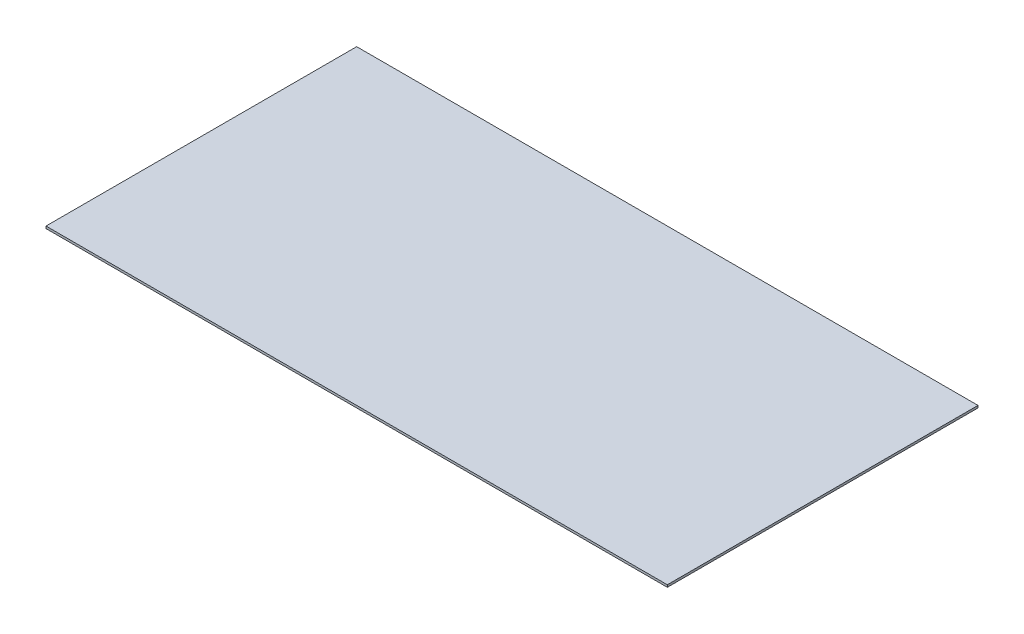
ISO-10303-21;
HEADER;
FILE_DESCRIPTION(('STEP AP214'),'2;1');
FILE_NAME('part.step','',(''),(''),'','','');
FILE_SCHEMA(('AUTOMOTIVE_DESIGN { 1 0 10303 214 1 1 1 1 }'));
ENDSEC;
DATA;
#1=APPLICATION_CONTEXT('core data for automotive mechanical design processes');
#2=APPLICATION_PROTOCOL_DEFINITION('international standard','automotive_design',2000,#1);
#3=PRODUCT_CONTEXT('',#1,'mechanical');
#4=PRODUCT('Part','Part','',(#3));
#5=PRODUCT_RELATED_PRODUCT_CATEGORY('part','',(#4));
#6=PRODUCT_DEFINITION_FORMATION('','',#4);
#7=PRODUCT_DEFINITION_CONTEXT('part definition',#1,'design');
#8=PRODUCT_DEFINITION('design','',#6,#7);
#9=PRODUCT_DEFINITION_SHAPE('','',#8);
#10=(LENGTH_UNIT() NAMED_UNIT(*) SI_UNIT(.MILLI.,.METRE.));
#11=(NAMED_UNIT(*) PLANE_ANGLE_UNIT() SI_UNIT($,.RADIAN.));
#12=(NAMED_UNIT(*) SI_UNIT($,.STERADIAN.) SOLID_ANGLE_UNIT());
#13=UNCERTAINTY_MEASURE_WITH_UNIT(LENGTH_MEASURE(1.E-05),#10,'distance_accuracy_value','');
#14=(GEOMETRIC_REPRESENTATION_CONTEXT(3) GLOBAL_UNCERTAINTY_ASSIGNED_CONTEXT((#13)) GLOBAL_UNIT_ASSIGNED_CONTEXT((#10,
#11,#12)) REPRESENTATION_CONTEXT('',''));
#15=CARTESIAN_POINT('',(0.,0.,0.));
#16=DIRECTION('',(0.,0.,1.));
#17=DIRECTION('',(1.,0.,0.));
#18=AXIS2_PLACEMENT_3D('',#15,#16,#17);
#19=CARTESIAN_POINT('',(-1250.,9.,625.));
#20=DIRECTION('',(1.,0.,0.));
#21=DIRECTION('',(0.,0.,-1.));
#22=AXIS2_PLACEMENT_3D('',#19,#20,#21);
#23=PLANE('',#22);
#24=DIRECTION('',(0.,0.,1.));
#25=VECTOR('',#24,1.);
#26=CARTESIAN_POINT('',(-1250.,0.,625.));
#27=LINE('',#26,#25);
#28=CARTESIAN_POINT('',(-1250.,0.,-625.));
#29=VERTEX_POINT('',#28);
#30=CARTESIAN_POINT('',(-1250.,0.,625.));
#31=VERTEX_POINT('',#30);
#32=EDGE_CURVE('E98',#29,#31,#27,.T.);
#33=ORIENTED_EDGE('',*,*,#32,.T.);
#34=DIRECTION('',(0.,-1.,0.));
#35=VECTOR('',#34,1.);
#36=CARTESIAN_POINT('',(-1250.,9.,625.));
#37=LINE('',#36,#35);
#38=CARTESIAN_POINT('',(-1250.,9.,625.));
#39=VERTEX_POINT('',#38);
#40=EDGE_CURVE('E11',#39,#31,#37,.T.);
#41=ORIENTED_EDGE('',*,*,#40,.F.);
#42=DIRECTION('',(0.,0.,1.));
#43=VECTOR('',#42,1.);
#44=CARTESIAN_POINT('',(-1250.,9.,625.));
#45=LINE('',#44,#43);
#46=CARTESIAN_POINT('',(-1250.,9.,-625.));
#47=VERTEX_POINT('',#46);
#48=EDGE_CURVE('E86',#47,#39,#45,.T.);
#49=ORIENTED_EDGE('',*,*,#48,.F.);
#50=DIRECTION('',(0.,-1.,0.));
#51=VECTOR('',#50,1.);
#52=CARTESIAN_POINT('',(-1250.,9.,-625.));
#53=LINE('',#52,#51);
#54=EDGE_CURVE('E94',#47,#29,#53,.T.);
#55=ORIENTED_EDGE('',*,*,#54,.T.);
#56=EDGE_LOOP('',(#33,#41,#49,#55));
#57=FACE_BOUND('',#56,.T.);
#58=ADVANCED_FACE('F35',(#57),#23,.F.);
#59=CARTESIAN_POINT('',(1250.,9.,625.));
#60=DIRECTION('',(0.,0.,-1.));
#61=DIRECTION('',(-1.,0.,0.));
#62=AXIS2_PLACEMENT_3D('',#59,#60,#61);
#63=PLANE('',#62);
#64=DIRECTION('',(1.,0.,0.));
#65=VECTOR('',#64,1.);
#66=CARTESIAN_POINT('',(1250.,0.,625.));
#67=LINE('',#66,#65);
#68=CARTESIAN_POINT('',(1250.,0.,625.));
#69=VERTEX_POINT('',#68);
#70=EDGE_CURVE('E90',#31,#69,#67,.T.);
#71=ORIENTED_EDGE('',*,*,#70,.T.);
#72=DIRECTION('',(0.,-1.,0.));
#73=VECTOR('',#72,1.);
#74=CARTESIAN_POINT('',(1250.,9.,625.));
#75=LINE('',#74,#73);
#76=CARTESIAN_POINT('',(1250.,9.,625.));
#77=VERTEX_POINT('',#76);
#78=EDGE_CURVE('E43',#77,#69,#75,.T.);
#79=ORIENTED_EDGE('',*,*,#78,.F.);
#80=DIRECTION('',(1.,0.,0.));
#81=VECTOR('',#80,1.);
#82=CARTESIAN_POINT('',(1250.,9.,625.));
#83=LINE('',#82,#81);
#84=EDGE_CURVE('E81',#39,#77,#83,.T.);
#85=ORIENTED_EDGE('',*,*,#84,.F.);
#86=ORIENTED_EDGE('',*,*,#40,.T.);
#87=EDGE_LOOP('',(#71,#79,#85,#86));
#88=FACE_BOUND('',#87,.T.);
#89=ADVANCED_FACE('F89',(#88),#63,.F.);
#90=CARTESIAN_POINT('',(1250.,9.,625.));
#91=DIRECTION('',(-1.,0.,0.));
#92=DIRECTION('',(0.,0.,1.));
#93=AXIS2_PLACEMENT_3D('',#90,#91,#92);
#94=PLANE('',#93);
#95=DIRECTION('',(0.,0.,-1.));
#96=VECTOR('',#95,1.);
#97=CARTESIAN_POINT('',(1250.,0.,625.));
#98=LINE('',#97,#96);
#99=CARTESIAN_POINT('',(1250.,0.,-625.));
#100=VERTEX_POINT('',#99);
#101=EDGE_CURVE('E68',#69,#100,#98,.T.);
#102=ORIENTED_EDGE('',*,*,#101,.T.);
#103=DIRECTION('',(0.,-1.,0.));
#104=VECTOR('',#103,1.);
#105=CARTESIAN_POINT('',(1250.,9.,-625.));
#106=LINE('',#105,#104);
#107=CARTESIAN_POINT('',(1250.,9.,-625.));
#108=VERTEX_POINT('',#107);
#109=EDGE_CURVE('E91',#108,#100,#106,.T.);
#110=ORIENTED_EDGE('',*,*,#109,.F.);
#111=DIRECTION('',(0.,0.,-1.));
#112=VECTOR('',#111,1.);
#113=CARTESIAN_POINT('',(1250.,9.,625.));
#114=LINE('',#113,#112);
#115=EDGE_CURVE('E84',#77,#108,#114,.T.);
#116=ORIENTED_EDGE('',*,*,#115,.F.);
#117=ORIENTED_EDGE('',*,*,#78,.T.);
#118=EDGE_LOOP('',(#102,#110,#116,#117));
#119=FACE_BOUND('',#118,.T.);
#120=ADVANCED_FACE('F92',(#119),#94,.F.);
#121=CARTESIAN_POINT('',(1250.,9.,-625.));
#122=DIRECTION('',(0.,0.,1.));
#123=DIRECTION('',(1.,0.,0.));
#124=AXIS2_PLACEMENT_3D('',#121,#122,#123);
#125=PLANE('',#124);
#126=DIRECTION('',(-1.,0.,0.));
#127=VECTOR('',#126,1.);
#128=CARTESIAN_POINT('',(1250.,0.,-625.));
#129=LINE('',#128,#127);
#130=EDGE_CURVE('E74',#100,#29,#129,.T.);
#131=ORIENTED_EDGE('',*,*,#130,.T.);
#132=ORIENTED_EDGE('',*,*,#54,.F.);
#133=DIRECTION('',(-1.,0.,0.));
#134=VECTOR('',#133,1.);
#135=CARTESIAN_POINT('',(1250.,9.,-625.));
#136=LINE('',#135,#134);
#137=EDGE_CURVE('E51',#108,#47,#136,.T.);
#138=ORIENTED_EDGE('',*,*,#137,.F.);
#139=ORIENTED_EDGE('',*,*,#109,.T.);
#140=EDGE_LOOP('',(#131,#132,#138,#139));
#141=FACE_BOUND('',#140,.T.);
#142=ADVANCED_FACE('F105',(#141),#125,.F.);
#143=CARTESIAN_POINT('',(0.,9.,0.));
#144=DIRECTION('',(0.,1.,0.));
#145=DIRECTION('',(0.,0.,1.));
#146=AXIS2_PLACEMENT_3D('',#143,#144,#145);
#147=PLANE('',#146);
#148=ORIENTED_EDGE('',*,*,#48,.T.);
#149=ORIENTED_EDGE('',*,*,#84,.T.);
#150=ORIENTED_EDGE('',*,*,#115,.T.);
#151=ORIENTED_EDGE('',*,*,#137,.T.);
#152=EDGE_LOOP('',(#148,#149,#150,#151));
#153=FACE_BOUND('',#152,.T.);
#154=ADVANCED_FACE('F82',(#153),#147,.T.);
#155=CARTESIAN_POINT('',(0.,0.,0.));
#156=DIRECTION('',(0.,1.,0.));
#157=DIRECTION('',(0.,0.,1.));
#158=AXIS2_PLACEMENT_3D('',#155,#156,#157);
#159=PLANE('',#158);
#160=ORIENTED_EDGE('',*,*,#32,.F.);
#161=ORIENTED_EDGE('',*,*,#130,.F.);
#162=ORIENTED_EDGE('',*,*,#101,.F.);
#163=ORIENTED_EDGE('',*,*,#70,.F.);
#164=EDGE_LOOP('',(#160,#161,#162,#163));
#165=FACE_BOUND('',#164,.T.);
#166=ADVANCED_FACE('F108',(#165),#159,.F.);
#167=CLOSED_SHELL('',(#58,#89,#120,#142,#154,#166));
#168=MANIFOLD_SOLID_BREP('B2',#167);
#169=ADVANCED_BREP_SHAPE_REPRESENTATION('',(#18,#168),#14);
#170=SHAPE_DEFINITION_REPRESENTATION(#9,#169);
ENDSEC;
END-ISO-10303-21;
